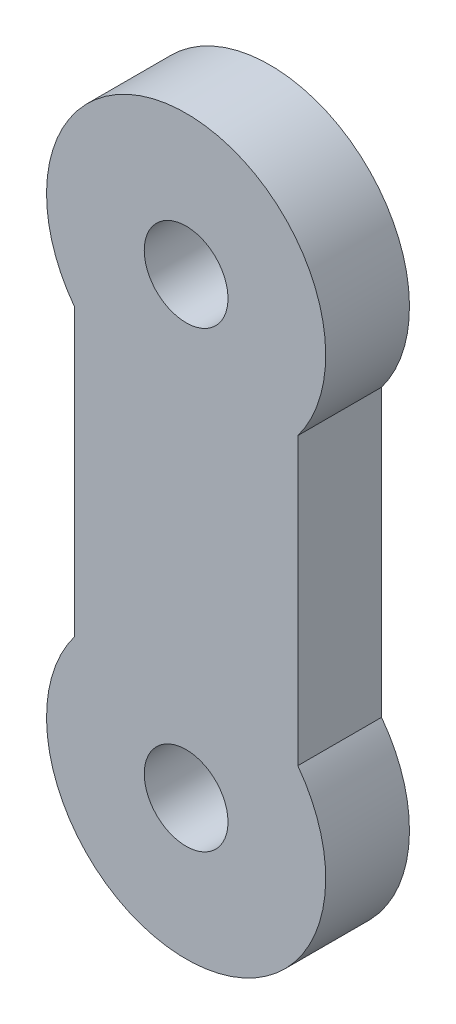
ISO-10303-21;
HEADER;
FILE_DESCRIPTION(('STEP AP214'),'2;1');
FILE_NAME('part.step','',(''),(''),'','','');
FILE_SCHEMA(('AUTOMOTIVE_DESIGN { 1 0 10303 214 1 1 1 1 }'));
ENDSEC;
DATA;
#1=APPLICATION_CONTEXT('core data for automotive mechanical design processes');
#2=APPLICATION_PROTOCOL_DEFINITION('international standard','automotive_design',2000,#1);
#3=PRODUCT_CONTEXT('',#1,'mechanical');
#4=PRODUCT('Part','Part','',(#3));
#5=PRODUCT_RELATED_PRODUCT_CATEGORY('part','',(#4));
#6=PRODUCT_DEFINITION_FORMATION('','',#4);
#7=PRODUCT_DEFINITION_CONTEXT('part definition',#1,'design');
#8=PRODUCT_DEFINITION('design','',#6,#7);
#9=PRODUCT_DEFINITION_SHAPE('','',#8);
#10=(LENGTH_UNIT() NAMED_UNIT(*) SI_UNIT(.MILLI.,.METRE.));
#11=(NAMED_UNIT(*) PLANE_ANGLE_UNIT() SI_UNIT($,.RADIAN.));
#12=(NAMED_UNIT(*) SI_UNIT($,.STERADIAN.) SOLID_ANGLE_UNIT());
#13=UNCERTAINTY_MEASURE_WITH_UNIT(LENGTH_MEASURE(1.E-05),#10,'distance_accuracy_value','');
#14=(GEOMETRIC_REPRESENTATION_CONTEXT(3) GLOBAL_UNCERTAINTY_ASSIGNED_CONTEXT((#13)) GLOBAL_UNIT_ASSIGNED_CONTEXT((#10,
#11,#12)) REPRESENTATION_CONTEXT('',''));
#15=CARTESIAN_POINT('',(0.,0.,0.));
#16=DIRECTION('',(0.,0.,1.));
#17=DIRECTION('',(1.,0.,0.));
#18=AXIS2_PLACEMENT_3D('',#15,#16,#17);
#19=CARTESIAN_POINT('',(0.,-8.12,3.));
#20=DIRECTION('',(0.,0.,-1.));
#21=DIRECTION('',(-1.,0.,0.));
#22=AXIS2_PLACEMENT_3D('',#19,#20,#21);
#23=CYLINDRICAL_SURFACE('',#22,5.);
#24=CARTESIAN_POINT('',(0.,-8.12,0.));
#25=DIRECTION('',(0.,0.,1.));
#26=DIRECTION('',(1.,0.,0.));
#27=AXIS2_PLACEMENT_3D('',#24,#25,#26);
#28=CIRCLE('',#27,5.);
#29=CARTESIAN_POINT('',(-4.,-5.11999999999999,0.));
#30=VERTEX_POINT('',#29);
#31=CARTESIAN_POINT('',(4.,-5.11999999999999,0.));
#32=VERTEX_POINT('',#31);
#33=EDGE_CURVE('E99',#30,#32,#28,.T.);
#34=ORIENTED_EDGE('',*,*,#33,.T.);
#35=DIRECTION('',(0.,0.,-1.));
#36=VECTOR('',#35,1.);
#37=CARTESIAN_POINT('',(4.,-5.11999999999999,3.));
#38=LINE('',#37,#36);
#39=CARTESIAN_POINT('',(4.,-5.11999999999999,3.));
#40=VERTEX_POINT('',#39);
#41=EDGE_CURVE('E11',#40,#32,#38,.T.);
#42=ORIENTED_EDGE('',*,*,#41,.F.);
#43=CARTESIAN_POINT('',(0.,-8.12,3.));
#44=DIRECTION('',(0.,0.,1.));
#45=DIRECTION('',(1.,0.,0.));
#46=AXIS2_PLACEMENT_3D('',#43,#44,#45);
#47=CIRCLE('',#46,5.);
#48=CARTESIAN_POINT('',(-4.,-5.11999999999999,3.));
#49=VERTEX_POINT('',#48);
#50=EDGE_CURVE('E85',#49,#40,#47,.T.);
#51=ORIENTED_EDGE('',*,*,#50,.F.);
#52=DIRECTION('',(0.,0.,-1.));
#53=VECTOR('',#52,1.);
#54=CARTESIAN_POINT('',(-4.,-5.11999999999999,3.));
#55=LINE('',#54,#53);
#56=EDGE_CURVE('E52',#49,#30,#55,.T.);
#57=ORIENTED_EDGE('',*,*,#56,.T.);
#58=EDGE_LOOP('',(#34,#42,#51,#57));
#59=FACE_BOUND('',#58,.T.);
#60=ADVANCED_FACE('F36',(#59),#23,.T.);
#61=CARTESIAN_POINT('',(4.,0.,3.));
#62=DIRECTION('',(-1.,0.,0.));
#63=DIRECTION('',(0.,0.,1.));
#64=AXIS2_PLACEMENT_3D('',#61,#62,#63);
#65=PLANE('',#64);
#66=DIRECTION('',(0.,1.,0.));
#67=VECTOR('',#66,1.);
#68=CARTESIAN_POINT('',(4.,0.,0.));
#69=LINE('',#68,#67);
#70=CARTESIAN_POINT('',(4.,5.11999999999999,0.));
#71=VERTEX_POINT('',#70);
#72=EDGE_CURVE('E90',#32,#71,#69,.T.);
#73=ORIENTED_EDGE('',*,*,#72,.T.);
#74=DIRECTION('',(0.,0.,-1.));
#75=VECTOR('',#74,1.);
#76=CARTESIAN_POINT('',(4.,5.11999999999999,3.));
#77=LINE('',#76,#75);
#78=CARTESIAN_POINT('',(4.,5.11999999999999,3.));
#79=VERTEX_POINT('',#78);
#80=EDGE_CURVE('E44',#79,#71,#77,.T.);
#81=ORIENTED_EDGE('',*,*,#80,.F.);
#82=DIRECTION('',(0.,1.,0.));
#83=VECTOR('',#82,1.);
#84=CARTESIAN_POINT('',(4.,0.,3.));
#85=LINE('',#84,#83);
#86=EDGE_CURVE('E78',#40,#79,#85,.T.);
#87=ORIENTED_EDGE('',*,*,#86,.F.);
#88=ORIENTED_EDGE('',*,*,#41,.T.);
#89=EDGE_LOOP('',(#73,#81,#87,#88));
#90=FACE_BOUND('',#89,.T.);
#91=ADVANCED_FACE('F89',(#90),#65,.F.);
#92=CARTESIAN_POINT('',(0.,8.12,3.));
#93=DIRECTION('',(0.,0.,-1.));
#94=DIRECTION('',(-1.,0.,0.));
#95=AXIS2_PLACEMENT_3D('',#92,#93,#94);
#96=CYLINDRICAL_SURFACE('',#95,5.);
#97=CARTESIAN_POINT('',(0.,8.12,0.));
#98=DIRECTION('',(0.,0.,1.));
#99=DIRECTION('',(1.,0.,0.));
#100=AXIS2_PLACEMENT_3D('',#97,#98,#99);
#101=CIRCLE('',#100,5.);
#102=CARTESIAN_POINT('',(-4.,5.11999999999999,0.));
#103=VERTEX_POINT('',#102);
#104=EDGE_CURVE('E103',#71,#103,#101,.T.);
#105=ORIENTED_EDGE('',*,*,#104,.T.);
#106=DIRECTION('',(0.,0.,-1.));
#107=VECTOR('',#106,1.);
#108=CARTESIAN_POINT('',(-4.,5.11999999999999,3.));
#109=LINE('',#108,#107);
#110=CARTESIAN_POINT('',(-4.,5.11999999999999,3.));
#111=VERTEX_POINT('',#110);
#112=EDGE_CURVE('E67',#111,#103,#109,.T.);
#113=ORIENTED_EDGE('',*,*,#112,.F.);
#114=CARTESIAN_POINT('',(0.,8.12,3.));
#115=DIRECTION('',(0.,0.,1.));
#116=DIRECTION('',(1.,0.,0.));
#117=AXIS2_PLACEMENT_3D('',#114,#115,#116);
#118=CIRCLE('',#117,5.);
#119=EDGE_CURVE('E84',#79,#111,#118,.T.);
#120=ORIENTED_EDGE('',*,*,#119,.F.);
#121=ORIENTED_EDGE('',*,*,#80,.T.);
#122=EDGE_LOOP('',(#105,#113,#120,#121));
#123=FACE_BOUND('',#122,.T.);
#124=ADVANCED_FACE('F93',(#123),#96,.T.);
#125=CARTESIAN_POINT('',(-4.,0.,3.));
#126=DIRECTION('',(-1.,0.,0.));
#127=DIRECTION('',(0.,0.,1.));
#128=AXIS2_PLACEMENT_3D('',#125,#126,#127);
#129=PLANE('',#128);
#130=DIRECTION('',(0.,1.,0.));
#131=VECTOR('',#130,1.);
#132=CARTESIAN_POINT('',(-4.,0.,0.));
#133=LINE('',#132,#131);
#134=EDGE_CURVE('E105',#30,#103,#133,.T.);
#135=ORIENTED_EDGE('',*,*,#134,.F.);
#136=ORIENTED_EDGE('',*,*,#56,.F.);
#137=DIRECTION('',(0.,1.,0.));
#138=VECTOR('',#137,1.);
#139=CARTESIAN_POINT('',(-4.,0.,3.));
#140=LINE('',#139,#138);
#141=EDGE_CURVE('E94',#49,#111,#140,.T.);
#142=ORIENTED_EDGE('',*,*,#141,.T.);
#143=ORIENTED_EDGE('',*,*,#112,.T.);
#144=EDGE_LOOP('',(#135,#136,#142,#143));
#145=FACE_BOUND('',#144,.T.);
#146=ADVANCED_FACE('F137',(#145),#129,.T.);
#147=CARTESIAN_POINT('',(0.,0.,3.));
#148=DIRECTION('',(0.,0.,1.));
#149=DIRECTION('',(1.,0.,0.));
#150=AXIS2_PLACEMENT_3D('',#147,#148,#149);
#151=PLANE('',#150);
#152=CARTESIAN_POINT('',(0.,8.12,3.));
#153=DIRECTION('',(0.,0.,-1.));
#154=DIRECTION('',(-1.,0.,0.));
#155=AXIS2_PLACEMENT_3D('',#152,#153,#154);
#156=CIRCLE('',#155,1.5);
#157=CARTESIAN_POINT('',(-1.5,8.12,3.));
#158=VERTEX_POINT('',#157);
#159=EDGE_CURVE('E101',#158,#158,#156,.T.);
#160=ORIENTED_EDGE('',*,*,#159,.T.);
#161=EDGE_LOOP('',(#160));
#162=FACE_BOUND('',#161,.T.);
#163=CARTESIAN_POINT('',(0.,-8.12,3.));
#164=DIRECTION('',(0.,0.,-1.));
#165=DIRECTION('',(1.,0.,0.));
#166=AXIS2_PLACEMENT_3D('',#163,#164,#165);
#167=CIRCLE('',#166,1.5);
#168=CARTESIAN_POINT('',(1.5,-8.12,3.));
#169=VERTEX_POINT('',#168);
#170=EDGE_CURVE('E114',#169,#169,#167,.T.);
#171=ORIENTED_EDGE('',*,*,#170,.T.);
#172=EDGE_LOOP('',(#171));
#173=FACE_BOUND('',#172,.T.);
#174=ORIENTED_EDGE('',*,*,#50,.T.);
#175=ORIENTED_EDGE('',*,*,#86,.T.);
#176=ORIENTED_EDGE('',*,*,#119,.T.);
#177=ORIENTED_EDGE('',*,*,#141,.F.);
#178=EDGE_LOOP('',(#174,#175,#176,#177));
#179=FACE_BOUND('',#178,.T.);
#180=ADVANCED_FACE('F81',(#162,#173,#179),#151,.T.);
#181=CARTESIAN_POINT('',(0.,0.,0.));
#182=DIRECTION('',(0.,0.,1.));
#183=DIRECTION('',(1.,0.,0.));
#184=AXIS2_PLACEMENT_3D('',#181,#182,#183);
#185=PLANE('',#184);
#186=CARTESIAN_POINT('',(0.,8.12,0.));
#187=DIRECTION('',(0.,0.,-1.));
#188=DIRECTION('',(-1.,0.,0.));
#189=AXIS2_PLACEMENT_3D('',#186,#187,#188);
#190=CIRCLE('',#189,1.5);
#191=CARTESIAN_POINT('',(-1.5,8.12,0.));
#192=VERTEX_POINT('',#191);
#193=EDGE_CURVE('E117',#192,#192,#190,.T.);
#194=ORIENTED_EDGE('',*,*,#193,.F.);
#195=EDGE_LOOP('',(#194));
#196=FACE_BOUND('',#195,.T.);
#197=CARTESIAN_POINT('',(0.,-8.12,0.));
#198=DIRECTION('',(0.,0.,-1.));
#199=DIRECTION('',(1.,0.,0.));
#200=AXIS2_PLACEMENT_3D('',#197,#198,#199);
#201=CIRCLE('',#200,1.5);
#202=CARTESIAN_POINT('',(1.5,-8.12,0.));
#203=VERTEX_POINT('',#202);
#204=EDGE_CURVE('E111',#203,#203,#201,.T.);
#205=ORIENTED_EDGE('',*,*,#204,.F.);
#206=EDGE_LOOP('',(#205));
#207=FACE_BOUND('',#206,.T.);
#208=ORIENTED_EDGE('',*,*,#33,.F.);
#209=ORIENTED_EDGE('',*,*,#134,.T.);
#210=ORIENTED_EDGE('',*,*,#104,.F.);
#211=ORIENTED_EDGE('',*,*,#72,.F.);
#212=EDGE_LOOP('',(#208,#209,#210,#211));
#213=FACE_BOUND('',#212,.T.);
#214=ADVANCED_FACE('F132',(#196,#207,#213),#185,.F.);
#215=CARTESIAN_POINT('',(0.,-8.12,3.));
#216=DIRECTION('',(0.,0.,-1.));
#217=DIRECTION('',(-1.,0.,0.));
#218=AXIS2_PLACEMENT_3D('',#215,#216,#217);
#219=CYLINDRICAL_SURFACE('',#218,1.5);
#220=ORIENTED_EDGE('',*,*,#170,.F.);
#221=EDGE_LOOP('',(#220));
#222=FACE_BOUND('',#221,.T.);
#223=ORIENTED_EDGE('',*,*,#204,.T.);
#224=EDGE_LOOP('',(#223));
#225=FACE_BOUND('',#224,.T.);
#226=ADVANCED_FACE('F128',(#222,#225),#219,.F.);
#227=CARTESIAN_POINT('',(0.,8.12,3.));
#228=DIRECTION('',(0.,0.,-1.));
#229=DIRECTION('',(-1.,0.,0.));
#230=AXIS2_PLACEMENT_3D('',#227,#228,#229);
#231=CYLINDRICAL_SURFACE('',#230,1.5);
#232=ORIENTED_EDGE('',*,*,#159,.F.);
#233=EDGE_LOOP('',(#232));
#234=FACE_BOUND('',#233,.T.);
#235=ORIENTED_EDGE('',*,*,#193,.T.);
#236=EDGE_LOOP('',(#235));
#237=FACE_BOUND('',#236,.T.);
#238=ADVANCED_FACE('F125',(#234,#237),#231,.F.);
#239=CLOSED_SHELL('',(#60,#91,#124,#146,#180,#214,#226,#238));
#240=MANIFOLD_SOLID_BREP('B2',#239);
#241=ADVANCED_BREP_SHAPE_REPRESENTATION('',(#18,#240),#14);
#242=SHAPE_DEFINITION_REPRESENTATION(#9,#241);
ENDSEC;
END-ISO-10303-21;
